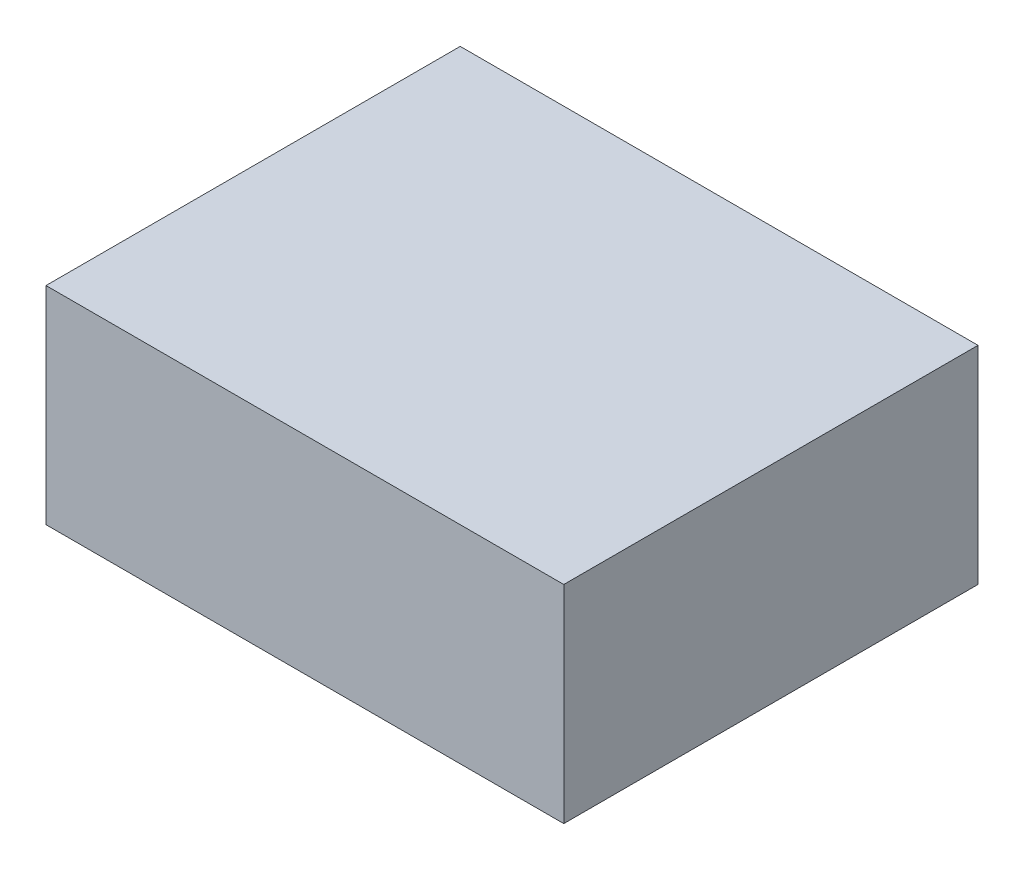
ISO-10303-21;
HEADER;
FILE_DESCRIPTION(('STEP AP214'),'2;1');
FILE_NAME('part.step','',(''),(''),'','','');
FILE_SCHEMA(('AUTOMOTIVE_DESIGN { 1 0 10303 214 1 1 1 1 }'));
ENDSEC;
DATA;
#1=APPLICATION_CONTEXT('core data for automotive mechanical design processes');
#2=APPLICATION_PROTOCOL_DEFINITION('international standard','automotive_design',2000,#1);
#3=PRODUCT_CONTEXT('',#1,'mechanical');
#4=PRODUCT('Part','Part','',(#3));
#5=PRODUCT_RELATED_PRODUCT_CATEGORY('part','',(#4));
#6=PRODUCT_DEFINITION_FORMATION('','',#4);
#7=PRODUCT_DEFINITION_CONTEXT('part definition',#1,'design');
#8=PRODUCT_DEFINITION('design','',#6,#7);
#9=PRODUCT_DEFINITION_SHAPE('','',#8);
#10=(LENGTH_UNIT() NAMED_UNIT(*) SI_UNIT(.MILLI.,.METRE.));
#11=(NAMED_UNIT(*) PLANE_ANGLE_UNIT() SI_UNIT($,.RADIAN.));
#12=(NAMED_UNIT(*) SI_UNIT($,.STERADIAN.) SOLID_ANGLE_UNIT());
#13=UNCERTAINTY_MEASURE_WITH_UNIT(LENGTH_MEASURE(1.E-05),#10,'distance_accuracy_value','');
#14=(GEOMETRIC_REPRESENTATION_CONTEXT(3) GLOBAL_UNCERTAINTY_ASSIGNED_CONTEXT((#13)) GLOBAL_UNIT_ASSIGNED_CONTEXT((#10,
#11,#12)) REPRESENTATION_CONTEXT('',''));
#15=CARTESIAN_POINT('',(0.,0.,0.));
#16=DIRECTION('',(0.,0.,1.));
#17=DIRECTION('',(1.,0.,0.));
#18=AXIS2_PLACEMENT_3D('',#15,#16,#17);
#19=CARTESIAN_POINT('',(0.,0.,40.));
#20=DIRECTION('',(1.,0.,0.));
#21=DIRECTION('',(0.,0.,-1.));
#22=AXIS2_PLACEMENT_3D('',#19,#20,#21);
#23=PLANE('',#22);
#24=DIRECTION('',(0.,-1.,0.));
#25=VECTOR('',#24,1.);
#26=CARTESIAN_POINT('',(0.,0.,0.));
#27=LINE('',#26,#25);
#28=CARTESIAN_POINT('',(0.,20.,0.));
#29=VERTEX_POINT('',#28);
#30=CARTESIAN_POINT('',(0.,0.,0.));
#31=VERTEX_POINT('',#30);
#32=EDGE_CURVE('E96',#29,#31,#27,.T.);
#33=ORIENTED_EDGE('',*,*,#32,.T.);
#34=DIRECTION('',(0.,0.,-1.));
#35=VECTOR('',#34,1.);
#36=CARTESIAN_POINT('',(0.,0.,40.));
#37=LINE('',#36,#35);
#38=CARTESIAN_POINT('',(0.,0.,40.));
#39=VERTEX_POINT('',#38);
#40=EDGE_CURVE('E11',#39,#31,#37,.T.);
#41=ORIENTED_EDGE('',*,*,#40,.F.);
#42=DIRECTION('',(0.,-1.,0.));
#43=VECTOR('',#42,1.);
#44=CARTESIAN_POINT('',(0.,0.,40.));
#45=LINE('',#44,#43);
#46=CARTESIAN_POINT('',(0.,20.,40.));
#47=VERTEX_POINT('',#46);
#48=EDGE_CURVE('E84',#47,#39,#45,.T.);
#49=ORIENTED_EDGE('',*,*,#48,.F.);
#50=DIRECTION('',(0.,0.,-1.));
#51=VECTOR('',#50,1.);
#52=CARTESIAN_POINT('',(0.,20.,40.));
#53=LINE('',#52,#51);
#54=EDGE_CURVE('E92',#47,#29,#53,.T.);
#55=ORIENTED_EDGE('',*,*,#54,.T.);
#56=EDGE_LOOP('',(#33,#41,#49,#55));
#57=FACE_BOUND('',#56,.T.);
#58=ADVANCED_FACE('F33',(#57),#23,.F.);
#59=CARTESIAN_POINT('',(0.,0.,40.));
#60=DIRECTION('',(0.,1.,0.));
#61=DIRECTION('',(0.,0.,1.));
#62=AXIS2_PLACEMENT_3D('',#59,#60,#61);
#63=PLANE('',#62);
#64=DIRECTION('',(1.,0.,0.));
#65=VECTOR('',#64,1.);
#66=CARTESIAN_POINT('',(0.,0.,0.));
#67=LINE('',#66,#65);
#68=CARTESIAN_POINT('',(50.,0.,0.));
#69=VERTEX_POINT('',#68);
#70=EDGE_CURVE('E88',#31,#69,#67,.T.);
#71=ORIENTED_EDGE('',*,*,#70,.T.);
#72=DIRECTION('',(0.,0.,-1.));
#73=VECTOR('',#72,1.);
#74=CARTESIAN_POINT('',(50.,0.,40.));
#75=LINE('',#74,#73);
#76=CARTESIAN_POINT('',(50.,0.,40.));
#77=VERTEX_POINT('',#76);
#78=EDGE_CURVE('E41',#77,#69,#75,.T.);
#79=ORIENTED_EDGE('',*,*,#78,.F.);
#80=DIRECTION('',(1.,0.,0.));
#81=VECTOR('',#80,1.);
#82=CARTESIAN_POINT('',(0.,0.,40.));
#83=LINE('',#82,#81);
#84=EDGE_CURVE('E79',#39,#77,#83,.T.);
#85=ORIENTED_EDGE('',*,*,#84,.F.);
#86=ORIENTED_EDGE('',*,*,#40,.T.);
#87=EDGE_LOOP('',(#71,#79,#85,#86));
#88=FACE_BOUND('',#87,.T.);
#89=ADVANCED_FACE('F87',(#88),#63,.F.);
#90=CARTESIAN_POINT('',(50.,0.,40.));
#91=DIRECTION('',(-1.,0.,0.));
#92=DIRECTION('',(0.,0.,1.));
#93=AXIS2_PLACEMENT_3D('',#90,#91,#92);
#94=PLANE('',#93);
#95=DIRECTION('',(0.,1.,0.));
#96=VECTOR('',#95,1.);
#97=CARTESIAN_POINT('',(50.,0.,0.));
#98=LINE('',#97,#96);
#99=CARTESIAN_POINT('',(50.,20.,0.));
#100=VERTEX_POINT('',#99);
#101=EDGE_CURVE('E66',#69,#100,#98,.T.);
#102=ORIENTED_EDGE('',*,*,#101,.T.);
#103=DIRECTION('',(0.,0.,-1.));
#104=VECTOR('',#103,1.);
#105=CARTESIAN_POINT('',(50.,20.,40.));
#106=LINE('',#105,#104);
#107=CARTESIAN_POINT('',(50.,20.,40.));
#108=VERTEX_POINT('',#107);
#109=EDGE_CURVE('E89',#108,#100,#106,.T.);
#110=ORIENTED_EDGE('',*,*,#109,.F.);
#111=DIRECTION('',(0.,1.,0.));
#112=VECTOR('',#111,1.);
#113=CARTESIAN_POINT('',(50.,0.,40.));
#114=LINE('',#113,#112);
#115=EDGE_CURVE('E82',#77,#108,#114,.T.);
#116=ORIENTED_EDGE('',*,*,#115,.F.);
#117=ORIENTED_EDGE('',*,*,#78,.T.);
#118=EDGE_LOOP('',(#102,#110,#116,#117));
#119=FACE_BOUND('',#118,.T.);
#120=ADVANCED_FACE('F90',(#119),#94,.F.);
#121=CARTESIAN_POINT('',(0.,20.,40.));
#122=DIRECTION('',(0.,-1.,0.));
#123=DIRECTION('',(0.,0.,-1.));
#124=AXIS2_PLACEMENT_3D('',#121,#122,#123);
#125=PLANE('',#124);
#126=DIRECTION('',(-1.,0.,0.));
#127=VECTOR('',#126,1.);
#128=CARTESIAN_POINT('',(0.,20.,0.));
#129=LINE('',#128,#127);
#130=EDGE_CURVE('E72',#100,#29,#129,.T.);
#131=ORIENTED_EDGE('',*,*,#130,.T.);
#132=ORIENTED_EDGE('',*,*,#54,.F.);
#133=DIRECTION('',(-1.,0.,0.));
#134=VECTOR('',#133,1.);
#135=CARTESIAN_POINT('',(0.,20.,40.));
#136=LINE('',#135,#134);
#137=EDGE_CURVE('E49',#108,#47,#136,.T.);
#138=ORIENTED_EDGE('',*,*,#137,.F.);
#139=ORIENTED_EDGE('',*,*,#109,.T.);
#140=EDGE_LOOP('',(#131,#132,#138,#139));
#141=FACE_BOUND('',#140,.T.);
#142=ADVANCED_FACE('F103',(#141),#125,.F.);
#143=CARTESIAN_POINT('',(0.,0.,40.));
#144=DIRECTION('',(0.,0.,-1.));
#145=DIRECTION('',(-1.,0.,0.));
#146=AXIS2_PLACEMENT_3D('',#143,#144,#145);
#147=PLANE('',#146);
#148=ORIENTED_EDGE('',*,*,#48,.T.);
#149=ORIENTED_EDGE('',*,*,#84,.T.);
#150=ORIENTED_EDGE('',*,*,#115,.T.);
#151=ORIENTED_EDGE('',*,*,#137,.T.);
#152=EDGE_LOOP('',(#148,#149,#150,#151));
#153=FACE_BOUND('',#152,.T.);
#154=ADVANCED_FACE('F80',(#153),#147,.F.);
#155=CARTESIAN_POINT('',(0.,0.,0.));
#156=DIRECTION('',(0.,0.,-1.));
#157=DIRECTION('',(-1.,0.,0.));
#158=AXIS2_PLACEMENT_3D('',#155,#156,#157);
#159=PLANE('',#158);
#160=ORIENTED_EDGE('',*,*,#32,.F.);
#161=ORIENTED_EDGE('',*,*,#130,.F.);
#162=ORIENTED_EDGE('',*,*,#101,.F.);
#163=ORIENTED_EDGE('',*,*,#70,.F.);
#164=EDGE_LOOP('',(#160,#161,#162,#163));
#165=FACE_BOUND('',#164,.T.);
#166=ADVANCED_FACE('F106',(#165),#159,.T.);
#167=CLOSED_SHELL('',(#58,#89,#120,#142,#154,#166));
#168=MANIFOLD_SOLID_BREP('B2',#167);
#169=ADVANCED_BREP_SHAPE_REPRESENTATION('',(#18,#168),#14);
#170=SHAPE_DEFINITION_REPRESENTATION(#9,#169);
ENDSEC;
END-ISO-10303-21;
